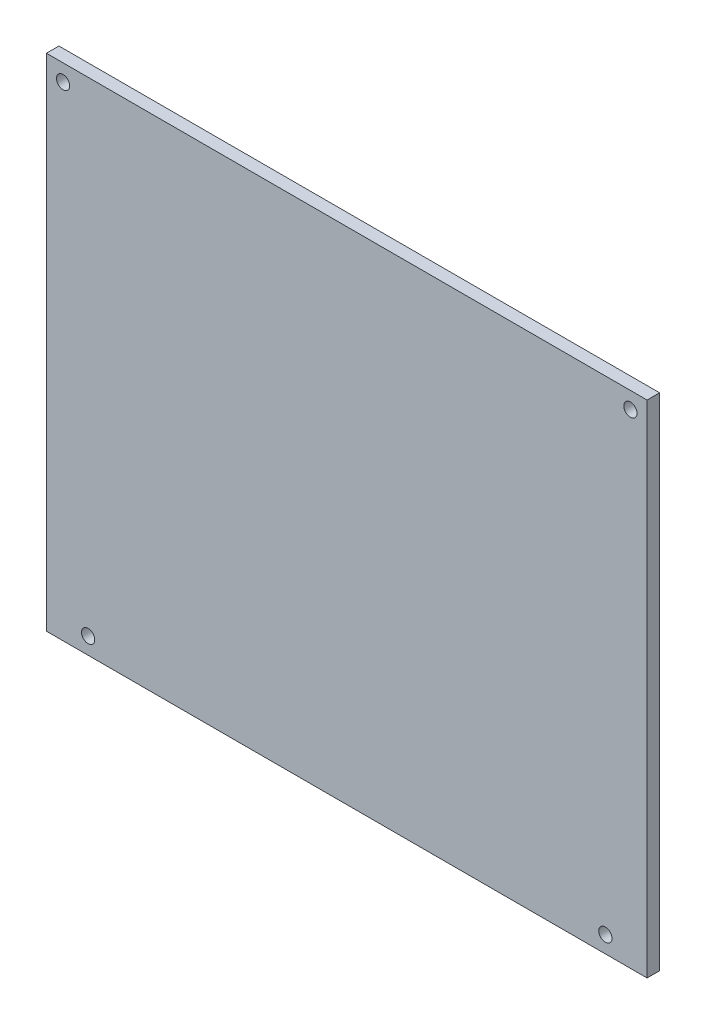
ISO-10303-21;
HEADER;
FILE_DESCRIPTION(('STEP AP214'),'2;1');
FILE_NAME('part.step','',(''),(''),'','','');
FILE_SCHEMA(('AUTOMOTIVE_DESIGN { 1 0 10303 214 1 1 1 1 }'));
ENDSEC;
DATA;
#1=APPLICATION_CONTEXT('core data for automotive mechanical design processes');
#2=APPLICATION_PROTOCOL_DEFINITION('international standard','automotive_design',2000,#1);
#3=PRODUCT_CONTEXT('',#1,'mechanical');
#4=PRODUCT('Part','Part','',(#3));
#5=PRODUCT_RELATED_PRODUCT_CATEGORY('part','',(#4));
#6=PRODUCT_DEFINITION_FORMATION('','',#4);
#7=PRODUCT_DEFINITION_CONTEXT('part definition',#1,'design');
#8=PRODUCT_DEFINITION('design','',#6,#7);
#9=PRODUCT_DEFINITION_SHAPE('','',#8);
#10=(LENGTH_UNIT() NAMED_UNIT(*) SI_UNIT(.MILLI.,.METRE.));
#11=(NAMED_UNIT(*) PLANE_ANGLE_UNIT() SI_UNIT($,.RADIAN.));
#12=(NAMED_UNIT(*) SI_UNIT($,.STERADIAN.) SOLID_ANGLE_UNIT());
#13=UNCERTAINTY_MEASURE_WITH_UNIT(LENGTH_MEASURE(1.E-05),#10,'distance_accuracy_value','');
#14=(GEOMETRIC_REPRESENTATION_CONTEXT(3) GLOBAL_UNCERTAINTY_ASSIGNED_CONTEXT((#13)) GLOBAL_UNIT_ASSIGNED_CONTEXT((#10,
#11,#12)) REPRESENTATION_CONTEXT('',''));
#15=CARTESIAN_POINT('',(0.,0.,0.));
#16=DIRECTION('',(0.,0.,1.));
#17=DIRECTION('',(1.,0.,0.));
#18=AXIS2_PLACEMENT_3D('',#15,#16,#17);
#19=CARTESIAN_POINT('',(-228.6,-189.23,9.525));
#20=DIRECTION('',(0.,1.,0.));
#21=DIRECTION('',(0.,0.,1.));
#22=AXIS2_PLACEMENT_3D('',#19,#20,#21);
#23=PLANE('',#22);
#24=DIRECTION('',(1.,0.,0.));
#25=VECTOR('',#24,1.);
#26=CARTESIAN_POINT('',(-228.6,-189.23,0.));
#27=LINE('',#26,#25);
#28=CARTESIAN_POINT('',(-228.6,-189.23,0.));
#29=VERTEX_POINT('',#28);
#30=CARTESIAN_POINT('',(228.6,-189.23,0.));
#31=VERTEX_POINT('',#30);
#32=EDGE_CURVE('E97',#29,#31,#27,.T.);
#33=ORIENTED_EDGE('',*,*,#32,.T.);
#34=DIRECTION('',(0.,0.,-1.));
#35=VECTOR('',#34,1.);
#36=CARTESIAN_POINT('',(228.6,-189.23,9.525));
#37=LINE('',#36,#35);
#38=CARTESIAN_POINT('',(228.6,-189.23,9.525));
#39=VERTEX_POINT('',#38);
#40=EDGE_CURVE('E11',#39,#31,#37,.T.);
#41=ORIENTED_EDGE('',*,*,#40,.F.);
#42=DIRECTION('',(1.,0.,0.));
#43=VECTOR('',#42,1.);
#44=CARTESIAN_POINT('',(-228.6,-189.23,9.525));
#45=LINE('',#44,#43);
#46=CARTESIAN_POINT('',(-228.6,-189.23,9.525));
#47=VERTEX_POINT('',#46);
#48=EDGE_CURVE('E83',#47,#39,#45,.T.);
#49=ORIENTED_EDGE('',*,*,#48,.F.);
#50=DIRECTION('',(0.,0.,-1.));
#51=VECTOR('',#50,1.);
#52=CARTESIAN_POINT('',(-228.6,-189.23,9.525));
#53=LINE('',#52,#51);
#54=EDGE_CURVE('E93',#47,#29,#53,.T.);
#55=ORIENTED_EDGE('',*,*,#54,.T.);
#56=EDGE_LOOP('',(#33,#41,#49,#55));
#57=FACE_BOUND('',#56,.T.);
#58=ADVANCED_FACE('F33',(#57),#23,.F.);
#59=CARTESIAN_POINT('',(228.6,-36.83,9.525));
#60=DIRECTION('',(-1.,0.,0.));
#61=DIRECTION('',(0.,-1.,0.));
#62=AXIS2_PLACEMENT_3D('',#59,#60,#61);
#63=PLANE('',#62);
#64=DIRECTION('',(0.,1.,0.));
#65=VECTOR('',#64,1.);
#66=CARTESIAN_POINT('',(228.6,-36.83,0.));
#67=LINE('',#66,#65);
#68=CARTESIAN_POINT('',(228.6,191.77,0.));
#69=VERTEX_POINT('',#68);
#70=EDGE_CURVE('E88',#31,#69,#67,.T.);
#71=ORIENTED_EDGE('',*,*,#70,.T.);
#72=DIRECTION('',(0.,0.,-1.));
#73=VECTOR('',#72,1.);
#74=CARTESIAN_POINT('',(228.6,191.77,9.525));
#75=LINE('',#74,#73);
#76=CARTESIAN_POINT('',(228.6,191.77,9.525));
#77=VERTEX_POINT('',#76);
#78=EDGE_CURVE('E41',#77,#69,#75,.T.);
#79=ORIENTED_EDGE('',*,*,#78,.F.);
#80=DIRECTION('',(0.,1.,0.));
#81=VECTOR('',#80,1.);
#82=CARTESIAN_POINT('',(228.6,-36.83,9.525));
#83=LINE('',#82,#81);
#84=EDGE_CURVE('E77',#39,#77,#83,.T.);
#85=ORIENTED_EDGE('',*,*,#84,.F.);
#86=ORIENTED_EDGE('',*,*,#40,.T.);
#87=EDGE_LOOP('',(#71,#79,#85,#86));
#88=FACE_BOUND('',#87,.T.);
#89=ADVANCED_FACE('F87',(#88),#63,.F.);
#90=CARTESIAN_POINT('',(-228.6,191.77,9.525));
#91=DIRECTION('',(0.,-1.,0.));
#92=DIRECTION('',(0.,0.,-1.));
#93=AXIS2_PLACEMENT_3D('',#90,#91,#92);
#94=PLANE('',#93);
#95=DIRECTION('',(-1.,0.,0.));
#96=VECTOR('',#95,1.);
#97=CARTESIAN_POINT('',(-228.6,191.77,0.));
#98=LINE('',#97,#96);
#99=CARTESIAN_POINT('',(-228.6,191.77,0.));
#100=VERTEX_POINT('',#99);
#101=EDGE_CURVE('E102',#69,#100,#98,.T.);
#102=ORIENTED_EDGE('',*,*,#101,.T.);
#103=DIRECTION('',(0.,0.,-1.));
#104=VECTOR('',#103,1.);
#105=CARTESIAN_POINT('',(-228.6,191.77,9.525));
#106=LINE('',#105,#104);
#107=CARTESIAN_POINT('',(-228.6,191.77,9.525));
#108=VERTEX_POINT('',#107);
#109=EDGE_CURVE('E90',#108,#100,#106,.T.);
#110=ORIENTED_EDGE('',*,*,#109,.F.);
#111=DIRECTION('',(-1.,0.,0.));
#112=VECTOR('',#111,1.);
#113=CARTESIAN_POINT('',(-228.6,191.77,9.525));
#114=LINE('',#113,#112);
#115=EDGE_CURVE('E80',#77,#108,#114,.T.);
#116=ORIENTED_EDGE('',*,*,#115,.F.);
#117=ORIENTED_EDGE('',*,*,#78,.T.);
#118=EDGE_LOOP('',(#102,#110,#116,#117));
#119=FACE_BOUND('',#118,.T.);
#120=ADVANCED_FACE('F91',(#119),#94,.F.);
#121=CARTESIAN_POINT('',(-228.6,-36.83,9.525));
#122=DIRECTION('',(1.,0.,0.));
#123=DIRECTION('',(0.,1.,0.));
#124=AXIS2_PLACEMENT_3D('',#121,#122,#123);
#125=PLANE('',#124);
#126=DIRECTION('',(0.,-1.,0.));
#127=VECTOR('',#126,1.);
#128=CARTESIAN_POINT('',(-228.6,-36.83,0.));
#129=LINE('',#128,#127);
#130=EDGE_CURVE('E66',#100,#29,#129,.T.);
#131=ORIENTED_EDGE('',*,*,#130,.T.);
#132=ORIENTED_EDGE('',*,*,#54,.F.);
#133=DIRECTION('',(0.,-1.,0.));
#134=VECTOR('',#133,1.);
#135=CARTESIAN_POINT('',(-228.6,-36.83,9.525));
#136=LINE('',#135,#134);
#137=EDGE_CURVE('E49',#108,#47,#136,.T.);
#138=ORIENTED_EDGE('',*,*,#137,.F.);
#139=ORIENTED_EDGE('',*,*,#109,.T.);
#140=EDGE_LOOP('',(#131,#132,#138,#139));
#141=FACE_BOUND('',#140,.T.);
#142=ADVANCED_FACE('F106',(#141),#125,.F.);
#143=CARTESIAN_POINT('',(0.,0.,9.525));
#144=DIRECTION('',(0.,0.,-1.));
#145=DIRECTION('',(-1.,0.,0.));
#146=AXIS2_PLACEMENT_3D('',#143,#144,#145);
#147=PLANE('',#146);
#148=CARTESIAN_POINT('',(-215.9,179.07,9.525));
#149=DIRECTION('',(0.,0.,1.));
#150=DIRECTION('',(1.,0.,0.));
#151=AXIS2_PLACEMENT_3D('',#148,#149,#150);
#152=CIRCLE('',#151,5.04189999999999);
#153=CARTESIAN_POINT('',(-210.8581,179.07,9.525));
#154=VERTEX_POINT('',#153);
#155=EDGE_CURVE('E129',#154,#154,#152,.T.);
#156=ORIENTED_EDGE('',*,*,#155,.F.);
#157=EDGE_LOOP('',(#156));
#158=FACE_BOUND('',#157,.T.);
#159=CARTESIAN_POINT('',(215.9,179.07,9.525));
#160=DIRECTION('',(0.,0.,1.));
#161=DIRECTION('',(1.,0.,0.));
#162=AXIS2_PLACEMENT_3D('',#159,#160,#161);
#163=CIRCLE('',#162,5.04189999999999);
#164=CARTESIAN_POINT('',(220.9419,179.07,9.525));
#165=VERTEX_POINT('',#164);
#166=EDGE_CURVE('E123',#165,#165,#163,.T.);
#167=ORIENTED_EDGE('',*,*,#166,.F.);
#168=EDGE_LOOP('',(#167));
#169=FACE_BOUND('',#168,.T.);
#170=CARTESIAN_POINT('',(196.85,-176.53,9.525));
#171=DIRECTION('',(0.,0.,1.));
#172=DIRECTION('',(1.,0.,0.));
#173=AXIS2_PLACEMENT_3D('',#170,#171,#172);
#174=CIRCLE('',#173,5.04189999999999);
#175=CARTESIAN_POINT('',(201.8919,-176.53,9.525));
#176=VERTEX_POINT('',#175);
#177=EDGE_CURVE('E117',#176,#176,#174,.T.);
#178=ORIENTED_EDGE('',*,*,#177,.F.);
#179=EDGE_LOOP('',(#178));
#180=FACE_BOUND('',#179,.T.);
#181=CARTESIAN_POINT('',(-196.85,-176.53,9.525));
#182=DIRECTION('',(0.,0.,1.));
#183=DIRECTION('',(1.,0.,0.));
#184=AXIS2_PLACEMENT_3D('',#181,#182,#183);
#185=CIRCLE('',#184,5.04189999999999);
#186=CARTESIAN_POINT('',(-191.8081,-176.53,9.525));
#187=VERTEX_POINT('',#186);
#188=EDGE_CURVE('E111',#187,#187,#185,.T.);
#189=ORIENTED_EDGE('',*,*,#188,.F.);
#190=EDGE_LOOP('',(#189));
#191=FACE_BOUND('',#190,.T.);
#192=ORIENTED_EDGE('',*,*,#48,.T.);
#193=ORIENTED_EDGE('',*,*,#84,.T.);
#194=ORIENTED_EDGE('',*,*,#115,.T.);
#195=ORIENTED_EDGE('',*,*,#137,.T.);
#196=EDGE_LOOP('',(#192,#193,#194,#195));
#197=FACE_BOUND('',#196,.T.);
#198=ADVANCED_FACE('F78',(#158,#169,#180,#191,#197),#147,.F.);
#199=CARTESIAN_POINT('',(0.,0.,0.));
#200=DIRECTION('',(0.,0.,-1.));
#201=DIRECTION('',(-1.,0.,0.));
#202=AXIS2_PLACEMENT_3D('',#199,#200,#201);
#203=PLANE('',#202);
#204=CARTESIAN_POINT('',(-215.9,179.07,0.));
#205=DIRECTION('',(0.,0.,-1.));
#206=DIRECTION('',(-1.,0.,0.));
#207=AXIS2_PLACEMENT_3D('',#204,#205,#206);
#208=CIRCLE('',#207,5.04189999999999);
#209=CARTESIAN_POINT('',(-220.9419,179.07,0.));
#210=VERTEX_POINT('',#209);
#211=EDGE_CURVE('E126',#210,#210,#208,.T.);
#212=ORIENTED_EDGE('',*,*,#211,.F.);
#213=EDGE_LOOP('',(#212));
#214=FACE_BOUND('',#213,.T.);
#215=CARTESIAN_POINT('',(215.9,179.07,0.));
#216=DIRECTION('',(0.,0.,-1.));
#217=DIRECTION('',(-1.,0.,0.));
#218=AXIS2_PLACEMENT_3D('',#215,#216,#217);
#219=CIRCLE('',#218,5.04189999999999);
#220=CARTESIAN_POINT('',(210.8581,179.07,0.));
#221=VERTEX_POINT('',#220);
#222=EDGE_CURVE('E120',#221,#221,#219,.T.);
#223=ORIENTED_EDGE('',*,*,#222,.F.);
#224=EDGE_LOOP('',(#223));
#225=FACE_BOUND('',#224,.T.);
#226=CARTESIAN_POINT('',(196.85,-176.53,0.));
#227=DIRECTION('',(0.,0.,-1.));
#228=DIRECTION('',(-1.,0.,0.));
#229=AXIS2_PLACEMENT_3D('',#226,#227,#228);
#230=CIRCLE('',#229,5.04189999999999);
#231=CARTESIAN_POINT('',(191.8081,-176.53,0.));
#232=VERTEX_POINT('',#231);
#233=EDGE_CURVE('E114',#232,#232,#230,.T.);
#234=ORIENTED_EDGE('',*,*,#233,.F.);
#235=EDGE_LOOP('',(#234));
#236=FACE_BOUND('',#235,.T.);
#237=CARTESIAN_POINT('',(-196.85,-176.53,0.));
#238=DIRECTION('',(0.,0.,-1.));
#239=DIRECTION('',(-1.,0.,0.));
#240=AXIS2_PLACEMENT_3D('',#237,#238,#239);
#241=CIRCLE('',#240,5.04189999999999);
#242=CARTESIAN_POINT('',(-201.8919,-176.53,0.));
#243=VERTEX_POINT('',#242);
#244=EDGE_CURVE('E100',#243,#243,#241,.T.);
#245=ORIENTED_EDGE('',*,*,#244,.F.);
#246=EDGE_LOOP('',(#245));
#247=FACE_BOUND('',#246,.T.);
#248=ORIENTED_EDGE('',*,*,#32,.F.);
#249=ORIENTED_EDGE('',*,*,#130,.F.);
#250=ORIENTED_EDGE('',*,*,#101,.F.);
#251=ORIENTED_EDGE('',*,*,#70,.F.);
#252=EDGE_LOOP('',(#248,#249,#250,#251));
#253=FACE_BOUND('',#252,.T.);
#254=ADVANCED_FACE('F137',(#214,#225,#236,#247,#253),#203,.T.);
#255=CARTESIAN_POINT('',(-196.85,-176.53,9.525));
#256=DIRECTION('',(0.,0.,1.));
#257=DIRECTION('',(1.,0.,0.));
#258=AXIS2_PLACEMENT_3D('',#255,#256,#257);
#259=CYLINDRICAL_SURFACE('',#258,5.04189999999999);
#260=ORIENTED_EDGE('',*,*,#244,.T.);
#261=EDGE_LOOP('',(#260));
#262=FACE_BOUND('',#261,.T.);
#263=ORIENTED_EDGE('',*,*,#188,.T.);
#264=EDGE_LOOP('',(#263));
#265=FACE_BOUND('',#264,.T.);
#266=ADVANCED_FACE('F145',(#262,#265),#259,.F.);
#267=CARTESIAN_POINT('',(196.85,-176.53,9.525));
#268=DIRECTION('',(0.,0.,1.));
#269=DIRECTION('',(1.,0.,0.));
#270=AXIS2_PLACEMENT_3D('',#267,#268,#269);
#271=CYLINDRICAL_SURFACE('',#270,5.04189999999999);
#272=ORIENTED_EDGE('',*,*,#233,.T.);
#273=EDGE_LOOP('',(#272));
#274=FACE_BOUND('',#273,.T.);
#275=ORIENTED_EDGE('',*,*,#177,.T.);
#276=EDGE_LOOP('',(#275));
#277=FACE_BOUND('',#276,.T.);
#278=ADVANCED_FACE('F147',(#274,#277),#271,.F.);
#279=CARTESIAN_POINT('',(215.9,179.07,9.525));
#280=DIRECTION('',(0.,0.,1.));
#281=DIRECTION('',(1.,0.,0.));
#282=AXIS2_PLACEMENT_3D('',#279,#280,#281);
#283=CYLINDRICAL_SURFACE('',#282,5.04189999999999);
#284=ORIENTED_EDGE('',*,*,#222,.T.);
#285=EDGE_LOOP('',(#284));
#286=FACE_BOUND('',#285,.T.);
#287=ORIENTED_EDGE('',*,*,#166,.T.);
#288=EDGE_LOOP('',(#287));
#289=FACE_BOUND('',#288,.T.);
#290=ADVANCED_FACE('F154',(#286,#289),#283,.F.);
#291=CARTESIAN_POINT('',(-215.9,179.07,9.525));
#292=DIRECTION('',(0.,0.,1.));
#293=DIRECTION('',(1.,0.,0.));
#294=AXIS2_PLACEMENT_3D('',#291,#292,#293);
#295=CYLINDRICAL_SURFACE('',#294,5.04189999999999);
#296=ORIENTED_EDGE('',*,*,#211,.T.);
#297=EDGE_LOOP('',(#296));
#298=FACE_BOUND('',#297,.T.);
#299=ORIENTED_EDGE('',*,*,#155,.T.);
#300=EDGE_LOOP('',(#299));
#301=FACE_BOUND('',#300,.T.);
#302=ADVANCED_FACE('F133',(#298,#301),#295,.F.);
#303=CLOSED_SHELL('',(#58,#89,#120,#142,#198,#254,#266,#278,#290,#302));
#304=MANIFOLD_SOLID_BREP('B2',#303);
#305=ADVANCED_BREP_SHAPE_REPRESENTATION('',(#18,#304),#14);
#306=SHAPE_DEFINITION_REPRESENTATION(#9,#305);
ENDSEC;
END-ISO-10303-21;
